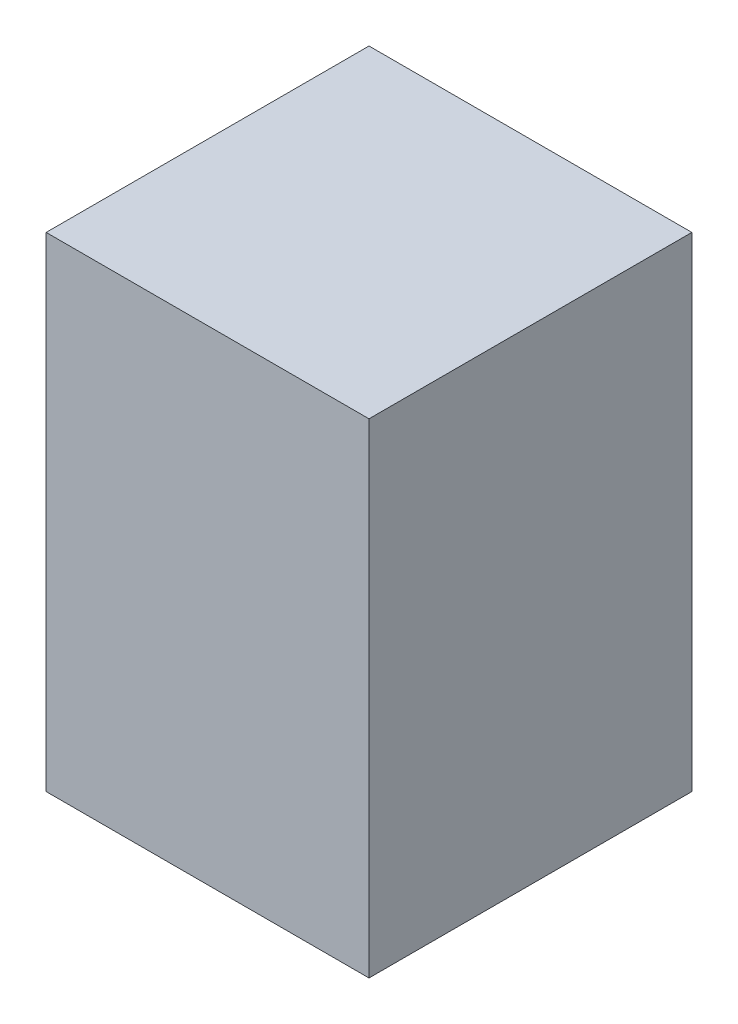
ISO-10303-21;
HEADER;
FILE_DESCRIPTION(('STEP AP214'),'2;1');
FILE_NAME('part.step','',(''),(''),'','','');
FILE_SCHEMA(('AUTOMOTIVE_DESIGN { 1 0 10303 214 1 1 1 1 }'));
ENDSEC;
DATA;
#1=APPLICATION_CONTEXT('core data for automotive mechanical design processes');
#2=APPLICATION_PROTOCOL_DEFINITION('international standard','automotive_design',2000,#1);
#3=PRODUCT_CONTEXT('',#1,'mechanical');
#4=PRODUCT('Part','Part','',(#3));
#5=PRODUCT_RELATED_PRODUCT_CATEGORY('part','',(#4));
#6=PRODUCT_DEFINITION_FORMATION('','',#4);
#7=PRODUCT_DEFINITION_CONTEXT('part definition',#1,'design');
#8=PRODUCT_DEFINITION('design','',#6,#7);
#9=PRODUCT_DEFINITION_SHAPE('','',#8);
#10=(LENGTH_UNIT() NAMED_UNIT(*) SI_UNIT(.MILLI.,.METRE.));
#11=(NAMED_UNIT(*) PLANE_ANGLE_UNIT() SI_UNIT($,.RADIAN.));
#12=(NAMED_UNIT(*) SI_UNIT($,.STERADIAN.) SOLID_ANGLE_UNIT());
#13=UNCERTAINTY_MEASURE_WITH_UNIT(LENGTH_MEASURE(1.E-05),#10,'distance_accuracy_value','');
#14=(GEOMETRIC_REPRESENTATION_CONTEXT(3) GLOBAL_UNCERTAINTY_ASSIGNED_CONTEXT((#13)) GLOBAL_UNIT_ASSIGNED_CONTEXT((#10,
#11,#12)) REPRESENTATION_CONTEXT('',''));
#15=CARTESIAN_POINT('',(0.,0.,0.));
#16=DIRECTION('',(0.,0.,1.));
#17=DIRECTION('',(1.,0.,0.));
#18=AXIS2_PLACEMENT_3D('',#15,#16,#17);
#19=CARTESIAN_POINT('',(0.,0.,10.));
#20=DIRECTION('',(-1.,0.,0.));
#21=DIRECTION('',(0.,0.,1.));
#22=AXIS2_PLACEMENT_3D('',#19,#20,#21);
#23=PLANE('',#22);
#24=DIRECTION('',(0.,1.,0.));
#25=VECTOR('',#24,1.);
#26=CARTESIAN_POINT('',(0.,0.,0.));
#27=LINE('',#26,#25);
#28=CARTESIAN_POINT('',(0.,0.,0.));
#29=VERTEX_POINT('',#28);
#30=CARTESIAN_POINT('',(0.,15.,0.));
#31=VERTEX_POINT('',#30);
#32=EDGE_CURVE('E96',#29,#31,#27,.T.);
#33=ORIENTED_EDGE('',*,*,#32,.T.);
#34=DIRECTION('',(0.,0.,-1.));
#35=VECTOR('',#34,1.);
#36=CARTESIAN_POINT('',(0.,15.,10.));
#37=LINE('',#36,#35);
#38=CARTESIAN_POINT('',(0.,15.,10.));
#39=VERTEX_POINT('',#38);
#40=EDGE_CURVE('E11',#39,#31,#37,.T.);
#41=ORIENTED_EDGE('',*,*,#40,.F.);
#42=DIRECTION('',(0.,1.,0.));
#43=VECTOR('',#42,1.);
#44=CARTESIAN_POINT('',(0.,0.,10.));
#45=LINE('',#44,#43);
#46=CARTESIAN_POINT('',(0.,0.,10.));
#47=VERTEX_POINT('',#46);
#48=EDGE_CURVE('E84',#47,#39,#45,.T.);
#49=ORIENTED_EDGE('',*,*,#48,.F.);
#50=DIRECTION('',(0.,0.,-1.));
#51=VECTOR('',#50,1.);
#52=CARTESIAN_POINT('',(0.,0.,10.));
#53=LINE('',#52,#51);
#54=EDGE_CURVE('E92',#47,#29,#53,.T.);
#55=ORIENTED_EDGE('',*,*,#54,.T.);
#56=EDGE_LOOP('',(#33,#41,#49,#55));
#57=FACE_BOUND('',#56,.T.);
#58=ADVANCED_FACE('F33',(#57),#23,.F.);
#59=CARTESIAN_POINT('',(0.,15.,10.));
#60=DIRECTION('',(0.,-1.,0.));
#61=DIRECTION('',(1.,0.,0.));
#62=AXIS2_PLACEMENT_3D('',#59,#60,#61);
#63=PLANE('',#62);
#64=DIRECTION('',(-1.,0.,0.));
#65=VECTOR('',#64,1.);
#66=CARTESIAN_POINT('',(0.,15.,0.));
#67=LINE('',#66,#65);
#68=CARTESIAN_POINT('',(-10.,15.,0.));
#69=VERTEX_POINT('',#68);
#70=EDGE_CURVE('E88',#31,#69,#67,.T.);
#71=ORIENTED_EDGE('',*,*,#70,.T.);
#72=DIRECTION('',(0.,0.,-1.));
#73=VECTOR('',#72,1.);
#74=CARTESIAN_POINT('',(-10.,15.,10.));
#75=LINE('',#74,#73);
#76=CARTESIAN_POINT('',(-10.,15.,10.));
#77=VERTEX_POINT('',#76);
#78=EDGE_CURVE('E41',#77,#69,#75,.T.);
#79=ORIENTED_EDGE('',*,*,#78,.F.);
#80=DIRECTION('',(-1.,0.,0.));
#81=VECTOR('',#80,1.);
#82=CARTESIAN_POINT('',(0.,15.,10.));
#83=LINE('',#82,#81);
#84=EDGE_CURVE('E79',#39,#77,#83,.T.);
#85=ORIENTED_EDGE('',*,*,#84,.F.);
#86=ORIENTED_EDGE('',*,*,#40,.T.);
#87=EDGE_LOOP('',(#71,#79,#85,#86));
#88=FACE_BOUND('',#87,.T.);
#89=ADVANCED_FACE('F87',(#88),#63,.F.);
#90=CARTESIAN_POINT('',(-10.,0.,10.));
#91=DIRECTION('',(1.,0.,0.));
#92=DIRECTION('',(0.,0.,-1.));
#93=AXIS2_PLACEMENT_3D('',#90,#91,#92);
#94=PLANE('',#93);
#95=DIRECTION('',(0.,-1.,0.));
#96=VECTOR('',#95,1.);
#97=CARTESIAN_POINT('',(-10.,0.,0.));
#98=LINE('',#97,#96);
#99=CARTESIAN_POINT('',(-10.,0.,0.));
#100=VERTEX_POINT('',#99);
#101=EDGE_CURVE('E66',#69,#100,#98,.T.);
#102=ORIENTED_EDGE('',*,*,#101,.T.);
#103=DIRECTION('',(0.,0.,-1.));
#104=VECTOR('',#103,1.);
#105=CARTESIAN_POINT('',(-10.,0.,10.));
#106=LINE('',#105,#104);
#107=CARTESIAN_POINT('',(-10.,0.,10.));
#108=VERTEX_POINT('',#107);
#109=EDGE_CURVE('E89',#108,#100,#106,.T.);
#110=ORIENTED_EDGE('',*,*,#109,.F.);
#111=DIRECTION('',(0.,-1.,0.));
#112=VECTOR('',#111,1.);
#113=CARTESIAN_POINT('',(-10.,0.,10.));
#114=LINE('',#113,#112);
#115=EDGE_CURVE('E82',#77,#108,#114,.T.);
#116=ORIENTED_EDGE('',*,*,#115,.F.);
#117=ORIENTED_EDGE('',*,*,#78,.T.);
#118=EDGE_LOOP('',(#102,#110,#116,#117));
#119=FACE_BOUND('',#118,.T.);
#120=ADVANCED_FACE('F90',(#119),#94,.F.);
#121=CARTESIAN_POINT('',(0.,0.,10.));
#122=DIRECTION('',(0.,1.,0.));
#123=DIRECTION('',(-1.,0.,0.));
#124=AXIS2_PLACEMENT_3D('',#121,#122,#123);
#125=PLANE('',#124);
#126=DIRECTION('',(1.,0.,0.));
#127=VECTOR('',#126,1.);
#128=CARTESIAN_POINT('',(0.,0.,0.));
#129=LINE('',#128,#127);
#130=EDGE_CURVE('E72',#100,#29,#129,.T.);
#131=ORIENTED_EDGE('',*,*,#130,.T.);
#132=ORIENTED_EDGE('',*,*,#54,.F.);
#133=DIRECTION('',(1.,0.,0.));
#134=VECTOR('',#133,1.);
#135=CARTESIAN_POINT('',(0.,0.,10.));
#136=LINE('',#135,#134);
#137=EDGE_CURVE('E49',#108,#47,#136,.T.);
#138=ORIENTED_EDGE('',*,*,#137,.F.);
#139=ORIENTED_EDGE('',*,*,#109,.T.);
#140=EDGE_LOOP('',(#131,#132,#138,#139));
#141=FACE_BOUND('',#140,.T.);
#142=ADVANCED_FACE('F103',(#141),#125,.F.);
#143=CARTESIAN_POINT('',(0.,0.,10.));
#144=DIRECTION('',(0.,0.,1.));
#145=DIRECTION('',(1.,0.,0.));
#146=AXIS2_PLACEMENT_3D('',#143,#144,#145);
#147=PLANE('',#146);
#148=ORIENTED_EDGE('',*,*,#48,.T.);
#149=ORIENTED_EDGE('',*,*,#84,.T.);
#150=ORIENTED_EDGE('',*,*,#115,.T.);
#151=ORIENTED_EDGE('',*,*,#137,.T.);
#152=EDGE_LOOP('',(#148,#149,#150,#151));
#153=FACE_BOUND('',#152,.T.);
#154=ADVANCED_FACE('F80',(#153),#147,.T.);
#155=CARTESIAN_POINT('',(0.,0.,0.));
#156=DIRECTION('',(0.,0.,1.));
#157=DIRECTION('',(1.,0.,0.));
#158=AXIS2_PLACEMENT_3D('',#155,#156,#157);
#159=PLANE('',#158);
#160=ORIENTED_EDGE('',*,*,#32,.F.);
#161=ORIENTED_EDGE('',*,*,#130,.F.);
#162=ORIENTED_EDGE('',*,*,#101,.F.);
#163=ORIENTED_EDGE('',*,*,#70,.F.);
#164=EDGE_LOOP('',(#160,#161,#162,#163));
#165=FACE_BOUND('',#164,.T.);
#166=ADVANCED_FACE('F106',(#165),#159,.F.);
#167=CLOSED_SHELL('',(#58,#89,#120,#142,#154,#166));
#168=MANIFOLD_SOLID_BREP('B2',#167);
#169=ADVANCED_BREP_SHAPE_REPRESENTATION('',(#18,#168),#14);
#170=SHAPE_DEFINITION_REPRESENTATION(#9,#169);
ENDSEC;
END-ISO-10303-21;
